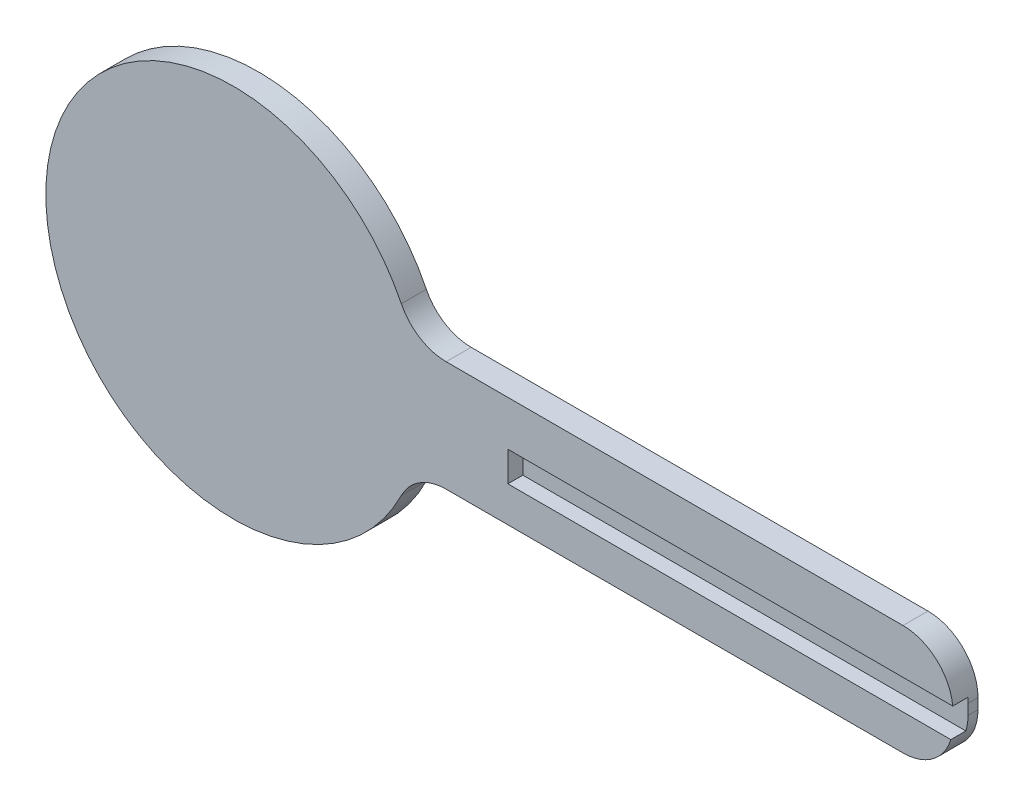
ISO-10303-21;
HEADER;
FILE_DESCRIPTION(('STEP AP214'),'2;1');
FILE_NAME('part.step','',(''),(''),'','','');
FILE_SCHEMA(('AUTOMOTIVE_DESIGN { 1 0 10303 214 1 1 1 1 }'));
ENDSEC;
DATA;
#1=APPLICATION_CONTEXT('core data for automotive mechanical design processes');
#2=APPLICATION_PROTOCOL_DEFINITION('international standard','automotive_design',2000,#1);
#3=PRODUCT_CONTEXT('',#1,'mechanical');
#4=PRODUCT('Part','Part','',(#3));
#5=PRODUCT_RELATED_PRODUCT_CATEGORY('part','',(#4));
#6=PRODUCT_DEFINITION_FORMATION('','',#4);
#7=PRODUCT_DEFINITION_CONTEXT('part definition',#1,'design');
#8=PRODUCT_DEFINITION('design','',#6,#7);
#9=PRODUCT_DEFINITION_SHAPE('','',#8);
#10=(LENGTH_UNIT() NAMED_UNIT(*) SI_UNIT(.MILLI.,.METRE.));
#11=(NAMED_UNIT(*) PLANE_ANGLE_UNIT() SI_UNIT($,.RADIAN.));
#12=(NAMED_UNIT(*) SI_UNIT($,.STERADIAN.) SOLID_ANGLE_UNIT());
#13=UNCERTAINTY_MEASURE_WITH_UNIT(LENGTH_MEASURE(1.E-05),#10,'distance_accuracy_value','');
#14=(GEOMETRIC_REPRESENTATION_CONTEXT(3) GLOBAL_UNCERTAINTY_ASSIGNED_CONTEXT((#13)) GLOBAL_UNIT_ASSIGNED_CONTEXT((#10,
#11,#12)) REPRESENTATION_CONTEXT('',''));
#15=CARTESIAN_POINT('',(0.,0.,0.));
#16=DIRECTION('',(0.,0.,1.));
#17=DIRECTION('',(1.,0.,0.));
#18=AXIS2_PLACEMENT_3D('',#15,#16,#17);
#19=CARTESIAN_POINT('',(267.939703110814,-2.08387103504767,10.));
#20=DIRECTION('',(0.,0.,-1.));
#21=DIRECTION('',(-1.,0.,0.));
#22=AXIS2_PLACEMENT_3D('',#19,#20,#21);
#23=CYLINDRICAL_SURFACE('',#22,20.);
#24=CARTESIAN_POINT('',(267.939703110814,-2.08387103504767,4.));
#25=DIRECTION('',(0.,0.,-1.));
#26=DIRECTION('',(-1.,0.,0.));
#27=AXIS2_PLACEMENT_3D('',#24,#25,#26);
#28=CIRCLE('',#27,20.);
#29=CARTESIAN_POINT('',(287.939703110814,-2.08387103504752,4.));
#30=VERTEX_POINT('',#29);
#31=CARTESIAN_POINT('',(287.080387362235,-7.88337156417846,4.));
#32=VERTEX_POINT('',#31);
#33=EDGE_CURVE('E248',#30,#32,#28,.T.);
#34=ORIENTED_EDGE('',*,*,#33,.T.);
#35=DIRECTION('',(0.,0.,-1.));
#36=VECTOR('',#35,1.);
#37=CARTESIAN_POINT('',(287.080387362235,-7.88337156417846,10.));
#38=LINE('',#37,#36);
#39=CARTESIAN_POINT('',(287.080387362235,-7.88337156417846,10.));
#40=VERTEX_POINT('',#39);
#41=EDGE_CURVE('E244',#32,#40,#38,.F.);
#42=ORIENTED_EDGE('',*,*,#41,.T.);
#43=CARTESIAN_POINT('',(267.939703110814,-2.08387103504767,10.));
#44=DIRECTION('',(0.,0.,1.));
#45=DIRECTION('',(1.,0.,0.));
#46=AXIS2_PLACEMENT_3D('',#43,#44,#45);
#47=CIRCLE('',#46,20.);
#48=CARTESIAN_POINT('',(267.939703110814,-22.0838710350477,10.));
#49=VERTEX_POINT('',#48);
#50=EDGE_CURVE('E161',#49,#40,#47,.T.);
#51=ORIENTED_EDGE('',*,*,#50,.F.);
#52=DIRECTION('',(0.,0.,-1.));
#53=VECTOR('',#52,1.);
#54=CARTESIAN_POINT('',(267.939703110814,-22.0838710350477,10.));
#55=LINE('',#54,#53);
#56=CARTESIAN_POINT('',(267.939703110814,-22.0838710350477,0.));
#57=VERTEX_POINT('',#56);
#58=EDGE_CURVE('E133',#49,#57,#55,.T.);
#59=ORIENTED_EDGE('',*,*,#58,.T.);
#60=CARTESIAN_POINT('',(267.939703110814,-2.08387103504767,0.));
#61=DIRECTION('',(0.,0.,1.));
#62=DIRECTION('',(1.,0.,0.));
#63=AXIS2_PLACEMENT_3D('',#60,#61,#62);
#64=CIRCLE('',#63,20.);
#65=CARTESIAN_POINT('',(287.939703110814,-2.08387103504752,0.));
#66=VERTEX_POINT('',#65);
#67=EDGE_CURVE('E137',#57,#66,#64,.T.);
#68=ORIENTED_EDGE('',*,*,#67,.T.);
#69=DIRECTION('',(0.,0.,-1.));
#70=VECTOR('',#69,1.);
#71=CARTESIAN_POINT('',(287.939703110814,-2.08387103504752,10.));
#72=LINE('',#71,#70);
#73=EDGE_CURVE('E11',#30,#66,#72,.T.);
#74=ORIENTED_EDGE('',*,*,#73,.F.);
#75=EDGE_LOOP('',(#34,#42,#51,#59,#68,#74));
#76=FACE_BOUND('',#75,.T.);
#77=ADVANCED_FACE('F38',(#76),#23,.T.);
#78=CARTESIAN_POINT('',(287.939703110814,2.08387103504752,10.));
#79=DIRECTION('',(-1.,0.,0.));
#80=DIRECTION('',(0.,0.,1.));
#81=AXIS2_PLACEMENT_3D('',#78,#79,#80);
#82=PLANE('',#81);
#83=DIRECTION('',(0.,0.,-1.));
#84=VECTOR('',#83,1.);
#85=CARTESIAN_POINT('',(287.939703110814,2.08387103504753,10.));
#86=LINE('',#85,#84);
#87=CARTESIAN_POINT('',(287.939703110814,2.08387103504753,4.));
#88=VERTEX_POINT('',#87);
#89=CARTESIAN_POINT('',(287.939703110814,2.08387103504753,0.));
#90=VERTEX_POINT('',#89);
#91=EDGE_CURVE('E47',#88,#90,#86,.T.);
#92=ORIENTED_EDGE('',*,*,#91,.F.);
#93=DIRECTION('',(0.,-1.,0.));
#94=VECTOR('',#93,1.);
#95=CARTESIAN_POINT('',(287.939703110814,2.08387103504752,4.));
#96=LINE('',#95,#94);
#97=EDGE_CURVE('E252',#88,#30,#96,.T.);
#98=ORIENTED_EDGE('',*,*,#97,.T.);
#99=ORIENTED_EDGE('',*,*,#73,.T.);
#100=DIRECTION('',(0.,1.,0.));
#101=VECTOR('',#100,1.);
#102=CARTESIAN_POINT('',(287.939703110814,2.08387103504752,0.));
#103=LINE('',#102,#101);
#104=EDGE_CURVE('E141',#66,#90,#103,.T.);
#105=ORIENTED_EDGE('',*,*,#104,.T.);
#106=EDGE_LOOP('',(#92,#98,#99,#105));
#107=FACE_BOUND('',#106,.T.);
#108=ADVANCED_FACE('F188',(#107),#82,.F.);
#109=CARTESIAN_POINT('',(267.939703110814,2.08387103504767,10.));
#110=DIRECTION('',(0.,0.,-1.));
#111=DIRECTION('',(-1.,0.,0.));
#112=AXIS2_PLACEMENT_3D('',#109,#110,#111);
#113=CYLINDRICAL_SURFACE('',#112,20.);
#114=CARTESIAN_POINT('',(267.939703110814,2.08387103504767,10.));
#115=DIRECTION('',(0.,0.,1.));
#116=DIRECTION('',(-1.,0.,0.));
#117=AXIS2_PLACEMENT_3D('',#114,#115,#116);
#118=CIRCLE('',#117,20.);
#119=CARTESIAN_POINT('',(287.836132372106,4.11662843582154,10.));
#120=VERTEX_POINT('',#119);
#121=CARTESIAN_POINT('',(267.939703110814,22.0838710350477,10.));
#122=VERTEX_POINT('',#121);
#123=EDGE_CURVE('E98',#120,#122,#118,.T.);
#124=ORIENTED_EDGE('',*,*,#123,.F.);
#125=DIRECTION('',(0.,0.,-1.));
#126=VECTOR('',#125,1.);
#127=CARTESIAN_POINT('',(287.836132372106,4.11662843582154,10.));
#128=LINE('',#127,#126);
#129=CARTESIAN_POINT('',(287.836132372106,4.11662843582154,4.));
#130=VERTEX_POINT('',#129);
#131=EDGE_CURVE('E231',#120,#130,#128,.T.);
#132=ORIENTED_EDGE('',*,*,#131,.T.);
#133=CARTESIAN_POINT('',(267.939703110814,2.08387103504767,4.));
#134=DIRECTION('',(0.,0.,-1.));
#135=DIRECTION('',(-1.,0.,0.));
#136=AXIS2_PLACEMENT_3D('',#133,#134,#135);
#137=CIRCLE('',#136,20.);
#138=EDGE_CURVE('E184',#130,#88,#137,.T.);
#139=ORIENTED_EDGE('',*,*,#138,.T.);
#140=ORIENTED_EDGE('',*,*,#91,.T.);
#141=CARTESIAN_POINT('',(267.939703110814,2.08387103504767,0.));
#142=DIRECTION('',(0.,0.,1.));
#143=DIRECTION('',(-1.,0.,0.));
#144=AXIS2_PLACEMENT_3D('',#141,#142,#143);
#145=CIRCLE('',#144,20.);
#146=CARTESIAN_POINT('',(267.939703110814,22.0838710350477,0.));
#147=VERTEX_POINT('',#146);
#148=EDGE_CURVE('E146',#90,#147,#145,.T.);
#149=ORIENTED_EDGE('',*,*,#148,.T.);
#150=DIRECTION('',(0.,0.,-1.));
#151=VECTOR('',#150,1.);
#152=CARTESIAN_POINT('',(267.939703110814,22.0838710350477,10.));
#153=LINE('',#152,#151);
#154=EDGE_CURVE('E172',#122,#147,#153,.T.);
#155=ORIENTED_EDGE('',*,*,#154,.F.);
#156=EDGE_LOOP('',(#124,#132,#139,#140,#149,#155));
#157=FACE_BOUND('',#156,.T.);
#158=ADVANCED_FACE('F179',(#157),#113,.T.);
#159=CARTESIAN_POINT('',(85.1701109468896,22.0838710350477,10.));
#160=DIRECTION('',(0.,-1.,0.));
#161=DIRECTION('',(1.,0.,0.));
#162=AXIS2_PLACEMENT_3D('',#159,#160,#161);
#163=PLANE('',#162);
#164=DIRECTION('',(-1.,0.,0.));
#165=VECTOR('',#164,1.);
#166=CARTESIAN_POINT('',(85.1701109468896,22.0838710350477,0.));
#167=LINE('',#166,#165);
#168=CARTESIAN_POINT('',(85.1701109468896,22.0838710350477,0.));
#169=VERTEX_POINT('',#168);
#170=EDGE_CURVE('E149',#147,#169,#167,.T.);
#171=ORIENTED_EDGE('',*,*,#170,.T.);
#172=DIRECTION('',(0.,0.,-1.));
#173=VECTOR('',#172,1.);
#174=CARTESIAN_POINT('',(85.1701109468896,22.0838710350477,10.));
#175=LINE('',#174,#173);
#176=CARTESIAN_POINT('',(85.1701109468896,22.0838710350477,10.));
#177=VERTEX_POINT('',#176);
#178=EDGE_CURVE('E168',#177,#169,#175,.T.);
#179=ORIENTED_EDGE('',*,*,#178,.F.);
#180=DIRECTION('',(-1.,0.,0.));
#181=VECTOR('',#180,1.);
#182=CARTESIAN_POINT('',(85.1701109468896,22.0838710350477,10.));
#183=LINE('',#182,#181);
#184=EDGE_CURVE('E202',#122,#177,#183,.T.);
#185=ORIENTED_EDGE('',*,*,#184,.F.);
#186=ORIENTED_EDGE('',*,*,#154,.T.);
#187=EDGE_LOOP('',(#171,#179,#185,#186));
#188=FACE_BOUND('',#187,.T.);
#189=ADVANCED_FACE('F197',(#188),#163,.F.);
#190=CARTESIAN_POINT('',(85.1701109468896,42.0838710350477,10.));
#191=DIRECTION('',(0.,0.,-1.));
#192=DIRECTION('',(-1.,0.,0.));
#193=AXIS2_PLACEMENT_3D('',#190,#191,#192);
#194=CYLINDRICAL_SURFACE('',#193,20.);
#195=CARTESIAN_POINT('',(85.1701109468896,42.0838710350477,0.));
#196=DIRECTION('',(0.,0.,-1.));
#197=DIRECTION('',(-1.,0.,0.));
#198=AXIS2_PLACEMENT_3D('',#195,#196,#197);
#199=CIRCLE('',#198,20.);
#200=CARTESIAN_POINT('',(67.2395612738602,33.2241087118797,0.));
#201=VERTEX_POINT('',#200);
#202=EDGE_CURVE('E152',#169,#201,#199,.T.);
#203=ORIENTED_EDGE('',*,*,#202,.T.);
#204=DIRECTION('',(0.,0.,-1.));
#205=VECTOR('',#204,1.);
#206=CARTESIAN_POINT('',(67.2395612738602,33.2241087118797,10.));
#207=LINE('',#206,#205);
#208=CARTESIAN_POINT('',(67.2395612738602,33.2241087118797,10.));
#209=VERTEX_POINT('',#208);
#210=EDGE_CURVE('E126',#209,#201,#207,.T.);
#211=ORIENTED_EDGE('',*,*,#210,.F.);
#212=CARTESIAN_POINT('',(85.1701109468896,42.0838710350477,10.));
#213=DIRECTION('',(0.,0.,-1.));
#214=DIRECTION('',(-1.,0.,0.));
#215=AXIS2_PLACEMENT_3D('',#212,#213,#214);
#216=CIRCLE('',#215,20.);
#217=EDGE_CURVE('E115',#177,#209,#216,.T.);
#218=ORIENTED_EDGE('',*,*,#217,.F.);
#219=ORIENTED_EDGE('',*,*,#178,.T.);
#220=EDGE_LOOP('',(#203,#211,#218,#219));
#221=FACE_BOUND('',#220,.T.);
#222=ADVANCED_FACE('F200',(#221),#194,.F.);
#223=CARTESIAN_POINT('',(0.,0.,10.));
#224=DIRECTION('',(0.,0.,-1.));
#225=DIRECTION('',(-1.,0.,0.));
#226=AXIS2_PLACEMENT_3D('',#223,#224,#225);
#227=CYLINDRICAL_SURFACE('',#226,75.);
#228=CARTESIAN_POINT('',(0.,0.,0.));
#229=DIRECTION('',(0.,0.,1.));
#230=DIRECTION('',(1.,0.,0.));
#231=AXIS2_PLACEMENT_3D('',#228,#229,#230);
#232=CIRCLE('',#231,75.);
#233=CARTESIAN_POINT('',(67.2395612738602,-33.2241087118797,0.));
#234=VERTEX_POINT('',#233);
#235=EDGE_CURVE('E124',#201,#234,#232,.T.);
#236=ORIENTED_EDGE('',*,*,#235,.T.);
#237=DIRECTION('',(0.,0.,-1.));
#238=VECTOR('',#237,1.);
#239=CARTESIAN_POINT('',(67.2395612738602,-33.2241087118797,10.));
#240=LINE('',#239,#238);
#241=CARTESIAN_POINT('',(67.2395612738602,-33.2241087118797,10.));
#242=VERTEX_POINT('',#241);
#243=EDGE_CURVE('E121',#242,#234,#240,.T.);
#244=ORIENTED_EDGE('',*,*,#243,.F.);
#245=CARTESIAN_POINT('',(0.,0.,10.));
#246=DIRECTION('',(0.,0.,1.));
#247=DIRECTION('',(1.,0.,0.));
#248=AXIS2_PLACEMENT_3D('',#245,#246,#247);
#249=CIRCLE('',#248,75.);
#250=EDGE_CURVE('E109',#209,#242,#249,.T.);
#251=ORIENTED_EDGE('',*,*,#250,.F.);
#252=ORIENTED_EDGE('',*,*,#210,.T.);
#253=EDGE_LOOP('',(#236,#244,#251,#252));
#254=FACE_BOUND('',#253,.T.);
#255=ADVANCED_FACE('F122',(#254),#227,.T.);
#256=CARTESIAN_POINT('',(85.1701109468896,-42.0838710350477,10.));
#257=DIRECTION('',(0.,0.,-1.));
#258=DIRECTION('',(-1.,0.,0.));
#259=AXIS2_PLACEMENT_3D('',#256,#257,#258);
#260=CYLINDRICAL_SURFACE('',#259,20.);
#261=CARTESIAN_POINT('',(85.1701109468896,-42.0838710350477,0.));
#262=DIRECTION('',(0.,0.,-1.));
#263=DIRECTION('',(1.,0.,0.));
#264=AXIS2_PLACEMENT_3D('',#261,#262,#263);
#265=CIRCLE('',#264,20.);
#266=CARTESIAN_POINT('',(85.1701109468896,-22.0838710350477,0.));
#267=VERTEX_POINT('',#266);
#268=EDGE_CURVE('E84',#234,#267,#265,.T.);
#269=ORIENTED_EDGE('',*,*,#268,.T.);
#270=DIRECTION('',(0.,0.,-1.));
#271=VECTOR('',#270,1.);
#272=CARTESIAN_POINT('',(85.1701109468896,-22.0838710350477,10.));
#273=LINE('',#272,#271);
#274=CARTESIAN_POINT('',(85.1701109468896,-22.0838710350477,10.));
#275=VERTEX_POINT('',#274);
#276=EDGE_CURVE('E127',#275,#267,#273,.T.);
#277=ORIENTED_EDGE('',*,*,#276,.F.);
#278=CARTESIAN_POINT('',(85.1701109468896,-42.0838710350477,10.));
#279=DIRECTION('',(0.,0.,-1.));
#280=DIRECTION('',(1.,0.,0.));
#281=AXIS2_PLACEMENT_3D('',#278,#279,#280);
#282=CIRCLE('',#281,20.);
#283=EDGE_CURVE('E113',#242,#275,#282,.T.);
#284=ORIENTED_EDGE('',*,*,#283,.F.);
#285=ORIENTED_EDGE('',*,*,#243,.T.);
#286=EDGE_LOOP('',(#269,#277,#284,#285));
#287=FACE_BOUND('',#286,.T.);
#288=ADVANCED_FACE('F129',(#287),#260,.F.);
#289=CARTESIAN_POINT('',(85.1701109468896,-22.0838710350477,10.));
#290=DIRECTION('',(0.,1.,0.));
#291=DIRECTION('',(-1.,0.,0.));
#292=AXIS2_PLACEMENT_3D('',#289,#290,#291);
#293=PLANE('',#292);
#294=DIRECTION('',(1.,0.,0.));
#295=VECTOR('',#294,1.);
#296=CARTESIAN_POINT('',(85.1701109468896,-22.0838710350477,0.));
#297=LINE('',#296,#295);
#298=EDGE_CURVE('E90',#267,#57,#297,.T.);
#299=ORIENTED_EDGE('',*,*,#298,.T.);
#300=ORIENTED_EDGE('',*,*,#58,.F.);
#301=DIRECTION('',(1.,0.,0.));
#302=VECTOR('',#301,1.);
#303=CARTESIAN_POINT('',(85.1701109468896,-22.0838710350477,10.));
#304=LINE('',#303,#302);
#305=EDGE_CURVE('E55',#275,#49,#304,.T.);
#306=ORIENTED_EDGE('',*,*,#305,.F.);
#307=ORIENTED_EDGE('',*,*,#276,.T.);
#308=EDGE_LOOP('',(#299,#300,#306,#307));
#309=FACE_BOUND('',#308,.T.);
#310=ADVANCED_FACE('F265',(#309),#293,.F.);
#311=CARTESIAN_POINT('',(267.939703110814,-2.08387103504767,10.));
#312=DIRECTION('',(0.,0.,1.));
#313=DIRECTION('',(1.,0.,0.));
#314=AXIS2_PLACEMENT_3D('',#311,#312,#313);
#315=PLANE('',#314);
#316=DIRECTION('',(-1.,0.,0.));
#317=VECTOR('',#316,1.);
#318=CARTESIAN_POINT('',(109.848439368626,4.11662843582154,10.));
#319=LINE('',#318,#317);
#320=CARTESIAN_POINT('',(109.848439368626,4.11662843582154,10.));
#321=VERTEX_POINT('',#320);
#322=EDGE_CURVE('E227',#120,#321,#319,.T.);
#323=ORIENTED_EDGE('',*,*,#322,.F.);
#324=ORIENTED_EDGE('',*,*,#123,.T.);
#325=ORIENTED_EDGE('',*,*,#184,.T.);
#326=ORIENTED_EDGE('',*,*,#217,.T.);
#327=ORIENTED_EDGE('',*,*,#250,.T.);
#328=ORIENTED_EDGE('',*,*,#283,.T.);
#329=ORIENTED_EDGE('',*,*,#305,.T.);
#330=ORIENTED_EDGE('',*,*,#50,.T.);
#331=DIRECTION('',(1.,0.,0.));
#332=VECTOR('',#331,1.);
#333=CARTESIAN_POINT('',(109.848439368626,-7.88337156417846,10.));
#334=LINE('',#333,#332);
#335=CARTESIAN_POINT('',(109.848439368626,-7.88337156417846,10.));
#336=VERTEX_POINT('',#335);
#337=EDGE_CURVE('E218',#336,#40,#334,.T.);
#338=ORIENTED_EDGE('',*,*,#337,.F.);
#339=DIRECTION('',(0.,-1.,0.));
#340=VECTOR('',#339,1.);
#341=CARTESIAN_POINT('',(109.848439368626,4.11662843582154,10.));
#342=LINE('',#341,#340);
#343=EDGE_CURVE('E223',#321,#336,#342,.T.);
#344=ORIENTED_EDGE('',*,*,#343,.F.);
#345=EDGE_LOOP('',(#323,#324,#325,#326,#327,#328,#329,#330,#338,#344));
#346=FACE_BOUND('',#345,.T.);
#347=ADVANCED_FACE('F111',(#346),#315,.T.);
#348=CARTESIAN_POINT('',(267.939703110814,-2.08387103504767,0.));
#349=DIRECTION('',(0.,0.,1.));
#350=DIRECTION('',(1.,0.,0.));
#351=AXIS2_PLACEMENT_3D('',#348,#349,#350);
#352=PLANE('',#351);
#353=ORIENTED_EDGE('',*,*,#67,.F.);
#354=ORIENTED_EDGE('',*,*,#298,.F.);
#355=ORIENTED_EDGE('',*,*,#268,.F.);
#356=ORIENTED_EDGE('',*,*,#235,.F.);
#357=ORIENTED_EDGE('',*,*,#202,.F.);
#358=ORIENTED_EDGE('',*,*,#170,.F.);
#359=ORIENTED_EDGE('',*,*,#148,.F.);
#360=ORIENTED_EDGE('',*,*,#104,.F.);
#361=EDGE_LOOP('',(#353,#354,#355,#356,#357,#358,#359,#360));
#362=FACE_BOUND('',#361,.T.);
#363=ADVANCED_FACE('F193',(#362),#352,.F.);
#364=CARTESIAN_POINT('',(109.848439368626,-7.88337156417846,4.));
#365=DIRECTION('',(0.,-1.,0.));
#366=DIRECTION('',(0.,0.,-1.));
#367=AXIS2_PLACEMENT_3D('',#364,#365,#366);
#368=PLANE('',#367);
#369=ORIENTED_EDGE('',*,*,#337,.T.);
#370=ORIENTED_EDGE('',*,*,#41,.F.);
#371=DIRECTION('',(1.,0.,0.));
#372=VECTOR('',#371,1.);
#373=CARTESIAN_POINT('',(109.848439368626,-7.88337156417846,4.));
#374=LINE('',#373,#372);
#375=CARTESIAN_POINT('',(109.848439368626,-7.88337156417846,4.));
#376=VERTEX_POINT('',#375);
#377=EDGE_CURVE('E214',#376,#32,#374,.T.);
#378=ORIENTED_EDGE('',*,*,#377,.F.);
#379=DIRECTION('',(0.,0.,1.));
#380=VECTOR('',#379,1.);
#381=CARTESIAN_POINT('',(109.848439368626,-7.88337156417846,4.));
#382=LINE('',#381,#380);
#383=EDGE_CURVE('E142',#376,#336,#382,.T.);
#384=ORIENTED_EDGE('',*,*,#383,.T.);
#385=EDGE_LOOP('',(#369,#370,#378,#384));
#386=FACE_BOUND('',#385,.T.);
#387=ADVANCED_FACE('F312',(#386),#368,.F.);
#388=CARTESIAN_POINT('',(109.848439368626,4.11662843582154,4.));
#389=DIRECTION('',(-1.,0.,0.));
#390=DIRECTION('',(0.,0.,1.));
#391=AXIS2_PLACEMENT_3D('',#388,#389,#390);
#392=PLANE('',#391);
#393=ORIENTED_EDGE('',*,*,#343,.T.);
#394=ORIENTED_EDGE('',*,*,#383,.F.);
#395=DIRECTION('',(0.,-1.,0.));
#396=VECTOR('',#395,1.);
#397=CARTESIAN_POINT('',(109.848439368626,4.11662843582154,4.));
#398=LINE('',#397,#396);
#399=CARTESIAN_POINT('',(109.848439368626,4.11662843582154,4.));
#400=VERTEX_POINT('',#399);
#401=EDGE_CURVE('E235',#400,#376,#398,.T.);
#402=ORIENTED_EDGE('',*,*,#401,.F.);
#403=DIRECTION('',(0.,0.,1.));
#404=VECTOR('',#403,1.);
#405=CARTESIAN_POINT('',(109.848439368626,4.11662843582154,4.));
#406=LINE('',#405,#404);
#407=EDGE_CURVE('E210',#400,#321,#406,.T.);
#408=ORIENTED_EDGE('',*,*,#407,.T.);
#409=EDGE_LOOP('',(#393,#394,#402,#408));
#410=FACE_BOUND('',#409,.T.);
#411=ADVANCED_FACE('F318',(#410),#392,.F.);
#412=CARTESIAN_POINT('',(109.848439368626,4.11662843582154,4.));
#413=DIRECTION('',(0.,1.,0.));
#414=DIRECTION('',(0.,0.,1.));
#415=AXIS2_PLACEMENT_3D('',#412,#413,#414);
#416=PLANE('',#415);
#417=ORIENTED_EDGE('',*,*,#322,.T.);
#418=ORIENTED_EDGE('',*,*,#407,.F.);
#419=DIRECTION('',(-1.,0.,0.));
#420=VECTOR('',#419,1.);
#421=CARTESIAN_POINT('',(109.848439368626,4.11662843582154,4.));
#422=LINE('',#421,#420);
#423=EDGE_CURVE('E222',#130,#400,#422,.T.);
#424=ORIENTED_EDGE('',*,*,#423,.F.);
#425=ORIENTED_EDGE('',*,*,#131,.F.);
#426=EDGE_LOOP('',(#417,#418,#424,#425));
#427=FACE_BOUND('',#426,.T.);
#428=ADVANCED_FACE('F321',(#427),#416,.F.);
#429=CARTESIAN_POINT('',(0.,0.,4.));
#430=DIRECTION('',(0.,0.,1.));
#431=DIRECTION('',(1.,0.,0.));
#432=AXIS2_PLACEMENT_3D('',#429,#430,#431);
#433=PLANE('',#432);
#434=ORIENTED_EDGE('',*,*,#377,.T.);
#435=ORIENTED_EDGE('',*,*,#33,.F.);
#436=ORIENTED_EDGE('',*,*,#97,.F.);
#437=ORIENTED_EDGE('',*,*,#138,.F.);
#438=ORIENTED_EDGE('',*,*,#423,.T.);
#439=ORIENTED_EDGE('',*,*,#401,.T.);
#440=EDGE_LOOP('',(#434,#435,#436,#437,#438,#439));
#441=FACE_BOUND('',#440,.T.);
#442=ADVANCED_FACE('F339',(#441),#433,.T.);
#443=CLOSED_SHELL('',(#77,#108,#158,#189,#222,#255,#288,#310,#347,#363,#387,#411,#428,#442));
#444=MANIFOLD_SOLID_BREP('B2',#443);
#445=ADVANCED_BREP_SHAPE_REPRESENTATION('',(#18,#444),#14);
#446=SHAPE_DEFINITION_REPRESENTATION(#9,#445);
ENDSEC;
END-ISO-10303-21;
